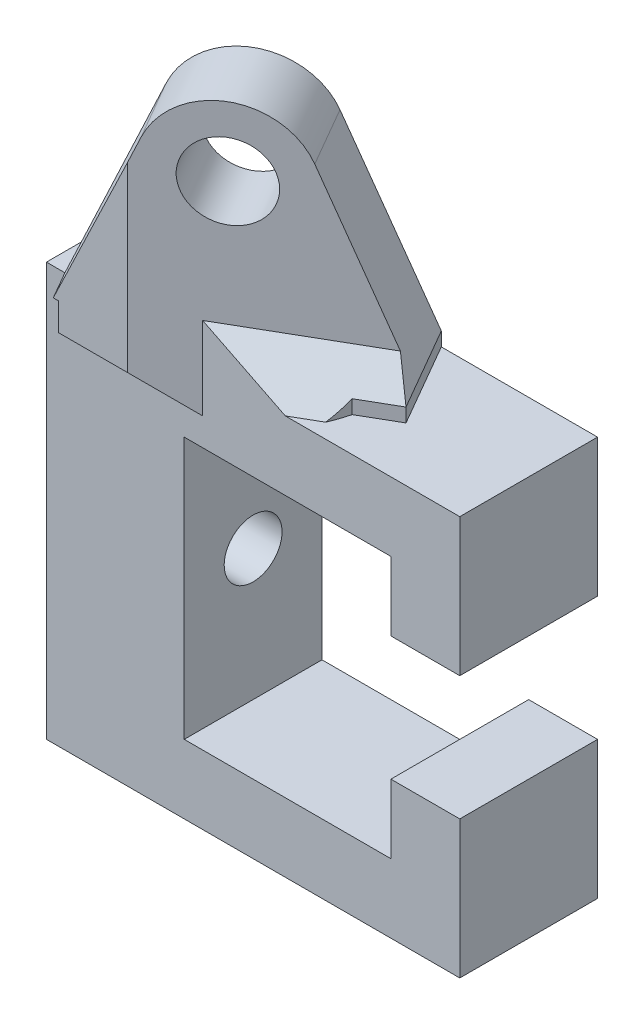
ISO-10303-21;
HEADER;
FILE_DESCRIPTION(('STEP AP214'),'2;1');
FILE_NAME('part.step','',(''),(''),'','','');
FILE_SCHEMA(('AUTOMOTIVE_DESIGN { 1 0 10303 214 1 1 1 1 }'));
ENDSEC;
DATA;
#1=APPLICATION_CONTEXT('core data for automotive mechanical design processes');
#2=APPLICATION_PROTOCOL_DEFINITION('international standard','automotive_design',2000,#1);
#3=PRODUCT_CONTEXT('',#1,'mechanical');
#4=PRODUCT('Part','Part','',(#3));
#5=PRODUCT_RELATED_PRODUCT_CATEGORY('part','',(#4));
#6=PRODUCT_DEFINITION_FORMATION('','',#4);
#7=PRODUCT_DEFINITION_CONTEXT('part definition',#1,'design');
#8=PRODUCT_DEFINITION('design','',#6,#7);
#9=PRODUCT_DEFINITION_SHAPE('','',#8);
#10=(LENGTH_UNIT() NAMED_UNIT(*) SI_UNIT(.MILLI.,.METRE.));
#11=(NAMED_UNIT(*) PLANE_ANGLE_UNIT() SI_UNIT($,.RADIAN.));
#12=(NAMED_UNIT(*) SI_UNIT($,.STERADIAN.) SOLID_ANGLE_UNIT());
#13=UNCERTAINTY_MEASURE_WITH_UNIT(LENGTH_MEASURE(1.E-05),#10,'distance_accuracy_value','');
#14=(GEOMETRIC_REPRESENTATION_CONTEXT(3) GLOBAL_UNCERTAINTY_ASSIGNED_CONTEXT((#13)) GLOBAL_UNIT_ASSIGNED_CONTEXT((#10,
#11,#12)) REPRESENTATION_CONTEXT('',''));
#15=CARTESIAN_POINT('',(0.,0.,0.));
#16=DIRECTION('',(0.,0.,1.));
#17=DIRECTION('',(1.,0.,0.));
#18=AXIS2_PLACEMENT_3D('',#15,#16,#17);
#19=CARTESIAN_POINT('',(0.,25.,0.));
#20=DIRECTION('',(0.,-1.,0.));
#21=DIRECTION('',(1.,0.,0.));
#22=AXIS2_PLACEMENT_3D('',#19,#20,#21);
#23=CYLINDRICAL_SURFACE('',#22,10.);
#24=DIRECTION('',(0.,1.,0.));
#25=VECTOR('',#24,1.);
#26=CARTESIAN_POINT('',(9.68465843842647,24.,2.49146361221968));
#27=LINE('',#26,#25);
#28=CARTESIAN_POINT('',(9.68465843842647,24.,2.49146361221968));
#29=VERTEX_POINT('',#28);
#30=CARTESIAN_POINT('',(9.68465843842647,25.,2.49146361221968));
#31=VERTEX_POINT('',#30);
#32=EDGE_CURVE('E203',#29,#31,#27,.T.);
#33=ORIENTED_EDGE('',*,*,#32,.T.);
#34=CARTESIAN_POINT('',(0.,32.0000000000001,0.));
#35=DIRECTION('',(-0.353553390593276,-0.707106781186544,-0.612372435695798));
#36=DIRECTION('',(0.353553390593273,-0.707106781186552,0.612372435695791));
#37=AXIS2_PLACEMENT_3D('',#34,#35,#36);
#38=ELLIPSE('',#37,14.142135623731,10.);
#39=CARTESIAN_POINT('',(9.19615242270661,24.,3.92820323027554));
#40=VERTEX_POINT('',#39);
#41=EDGE_CURVE('E190',#31,#40,#38,.T.);
#42=ORIENTED_EDGE('',*,*,#41,.T.);
#43=CARTESIAN_POINT('',(0.,24.,0.));
#44=DIRECTION('',(0.,1.,0.));
#45=DIRECTION('',(-1.,0.,0.));
#46=AXIS2_PLACEMENT_3D('',#43,#44,#45);
#47=CIRCLE('',#46,10.);
#48=EDGE_CURVE('E204',#40,#29,#47,.T.);
#49=ORIENTED_EDGE('',*,*,#48,.T.);
#50=EDGE_LOOP('',(#33,#42,#49));
#51=FACE_BOUND('',#50,.T.);
#52=ADVANCED_FACE('F35',(#51),#23,.T.);
#53=CARTESIAN_POINT('',(20.,24.,5.));
#54=DIRECTION('',(0.,-1.,0.));
#55=DIRECTION('',(1.,0.,0.));
#56=AXIS2_PLACEMENT_3D('',#53,#54,#55);
#57=PLANE('',#56);
#58=DIRECTION('',(0.500000000000001,0.,0.866025403784438));
#59=VECTOR('',#58,1.);
#60=CARTESIAN_POINT('',(8.66025403784438,24.,-5.00000000000001));
#61=LINE('',#60,#59);
#62=CARTESIAN_POINT('',(8.66025403784438,24.,-5.00000000000001));
#63=VERTEX_POINT('',#62);
#64=CARTESIAN_POINT('',(12.1602540378444,24.,1.06217782649109));
#65=VERTEX_POINT('',#64);
#66=EDGE_CURVE('E50',#63,#65,#61,.T.);
#67=ORIENTED_EDGE('',*,*,#66,.T.);
#68=DIRECTION('',(-0.866025403784438,0.,0.5));
#69=VECTOR('',#68,1.);
#70=CARTESIAN_POINT('',(12.1602540378444,24.,1.06217782649109));
#71=LINE('',#70,#69);
#72=EDGE_CURVE('E55',#65,#29,#71,.T.);
#73=ORIENTED_EDGE('',*,*,#72,.T.);
#74=ORIENTED_EDGE('',*,*,#48,.F.);
#75=DIRECTION('',(-0.866025403784438,0.,0.500000000000001));
#76=VECTOR('',#75,1.);
#77=CARTESIAN_POINT('',(16.8349364905389,24.,-0.482050807568867));
#78=LINE('',#77,#76);
#79=CARTESIAN_POINT('',(7.33974596215565,24.,5.));
#80=VERTEX_POINT('',#79);
#81=EDGE_CURVE('E198',#40,#80,#78,.T.);
#82=ORIENTED_EDGE('',*,*,#81,.T.);
#83=DIRECTION('',(-1.,0.,0.));
#84=VECTOR('',#83,1.);
#85=CARTESIAN_POINT('',(20.,24.,5.));
#86=LINE('',#85,#84);
#87=CARTESIAN_POINT('',(20.,24.,5.));
#88=VERTEX_POINT('',#87);
#89=EDGE_CURVE('E312',#88,#80,#86,.T.);
#90=ORIENTED_EDGE('',*,*,#89,.F.);
#91=DIRECTION('',(0.,0.,-1.));
#92=VECTOR('',#91,1.);
#93=CARTESIAN_POINT('',(20.,24.,5.));
#94=LINE('',#93,#92);
#95=CARTESIAN_POINT('',(20.,24.,-5.));
#96=VERTEX_POINT('',#95);
#97=EDGE_CURVE('E353',#88,#96,#94,.T.);
#98=ORIENTED_EDGE('',*,*,#97,.T.);
#99=DIRECTION('',(-1.,0.,0.));
#100=VECTOR('',#99,1.);
#101=CARTESIAN_POINT('',(20.,24.,-5.));
#102=LINE('',#101,#100);
#103=EDGE_CURVE('E338',#96,#63,#102,.T.);
#104=ORIENTED_EDGE('',*,*,#103,.T.);
#105=EDGE_LOOP('',(#67,#73,#74,#82,#90,#98,#104));
#106=FACE_BOUND('',#105,.T.);
#107=ADVANCED_FACE('F383',(#106),#57,.F.);
#108=CARTESIAN_POINT('',(0.,36.,0.));
#109=DIRECTION('',(0.500000000000001,0.,0.866025403784438));
#110=DIRECTION('',(0.866025403784438,0.,-0.500000000000001));
#111=AXIS2_PLACEMENT_3D('',#108,#109,#110);
#112=PLANE('',#111);
#113=CARTESIAN_POINT('',(0.,36.,0.));
#114=DIRECTION('',(0.500000000000001,0.,0.866025403784438));
#115=DIRECTION('',(0.866025403784438,0.,-0.500000000000001));
#116=AXIS2_PLACEMENT_3D('',#113,#114,#115);
#117=CIRCLE('',#116,2.75);
#118=CARTESIAN_POINT('',(2.38156986040721,36.,-1.375));
#119=VERTEX_POINT('',#118);
#120=EDGE_CURVE('E250',#119,#119,#117,.T.);
#121=ORIENTED_EDGE('',*,*,#120,.T.);
#122=EDGE_LOOP('',(#121));
#123=FACE_BOUND('',#122,.T.);
#124=DIRECTION('',(0.866025403784438,0.,-0.500000000000001));
#125=VECTOR('',#124,1.);
#126=CARTESIAN_POINT('',(-8.66025403784439,25.,5.00000000000001));
#127=LINE('',#126,#125);
#128=CARTESIAN_POINT('',(-8.66025403784439,25.,5.00000000000001));
#129=VERTEX_POINT('',#128);
#130=CARTESIAN_POINT('',(8.66025403784438,25.,-5.00000000000001));
#131=VERTEX_POINT('',#130);
#132=EDGE_CURVE('E404',#129,#131,#127,.T.);
#133=ORIENTED_EDGE('',*,*,#132,.F.);
#134=DIRECTION('',(-0.333086693763246,-0.923076923076923,0.192307692307693));
#135=VECTOR('',#134,1.);
#136=CARTESIAN_POINT('',(-8.66025403784439,25.,5.00000000000001));
#137=LINE('',#136,#135);
#138=CARTESIAN_POINT('',(-3.99704032515894,37.9230769230769,2.30769230769231));
#139=VERTEX_POINT('',#138);
#140=EDGE_CURVE('E260',#139,#129,#137,.T.);
#141=ORIENTED_EDGE('',*,*,#140,.F.);
#142=CARTESIAN_POINT('',(0.,36.,0.));
#143=DIRECTION('',(0.500000000000001,0.,0.866025403784438));
#144=DIRECTION('',(0.866025403784438,0.,-0.500000000000001));
#145=AXIS2_PLACEMENT_3D('',#142,#143,#144);
#146=CIRCLE('',#145,5.);
#147=CARTESIAN_POINT('',(3.99704032515894,37.9230769230769,-2.30769230769231));
#148=VERTEX_POINT('',#147);
#149=EDGE_CURVE('E266',#148,#139,#146,.T.);
#150=ORIENTED_EDGE('',*,*,#149,.F.);
#151=DIRECTION('',(-0.333086693763245,0.923076923076923,0.192307692307693));
#152=VECTOR('',#151,1.);
#153=CARTESIAN_POINT('',(8.66025403784438,25.,-5.00000000000001));
#154=LINE('',#153,#152);
#155=EDGE_CURVE('E254',#131,#148,#154,.T.);
#156=ORIENTED_EDGE('',*,*,#155,.F.);
#157=EDGE_LOOP('',(#133,#141,#150,#156));
#158=FACE_BOUND('',#157,.T.);
#159=ADVANCED_FACE('F426',(#123,#158),#112,.F.);
#160=CARTESIAN_POINT('',(0.,25.,0.));
#161=DIRECTION('',(0.,1.,0.));
#162=DIRECTION('',(-1.,0.,0.));
#163=AXIS2_PLACEMENT_3D('',#160,#161,#162);
#164=CIRCLE('',#163,10.);
#165=CARTESIAN_POINT('',(-7.14142842854286,25.,7.));
#166=VERTEX_POINT('',#165);
#167=EDGE_CURVE('E281',#129,#166,#164,.T.);
#168=ORIENTED_EDGE('',*,*,#167,.F.);
#169=DIRECTION('',(0.,1.,0.));
#170=VECTOR('',#169,1.);
#171=CARTESIAN_POINT('',(-8.66025403784439,24.,5.00000000000001));
#172=LINE('',#171,#170);
#173=CARTESIAN_POINT('',(-8.66025403784439,21.,5.));
#174=VERTEX_POINT('',#173);
#175=EDGE_CURVE('E245',#174,#129,#172,.T.);
#176=ORIENTED_EDGE('',*,*,#175,.F.);
#177=CARTESIAN_POINT('',(0.,16.,0.));
#178=DIRECTION('',(0.,0.707106781186551,-0.707106781186544));
#179=DIRECTION('',(0.,-0.707106781186544,-0.707106781186551));
#180=AXIS2_PLACEMENT_3D('',#177,#178,#179);
#181=ELLIPSE('',#180,14.1421356237309,10.);
#182=CARTESIAN_POINT('',(-7.14142842854286,23.,7.));
#183=VERTEX_POINT('',#182);
#184=EDGE_CURVE('E218',#174,#183,#181,.T.);
#185=ORIENTED_EDGE('',*,*,#184,.T.);
#186=DIRECTION('',(0.,-1.,0.));
#187=VECTOR('',#186,1.);
#188=CARTESIAN_POINT('',(-7.14142842854286,25.,7.));
#189=LINE('',#188,#187);
#190=EDGE_CURVE('E228',#166,#183,#189,.T.);
#191=ORIENTED_EDGE('',*,*,#190,.F.);
#192=EDGE_LOOP('',(#168,#176,#185,#191));
#193=FACE_BOUND('',#192,.T.);
#194=ADVANCED_FACE('F417',(#193),#23,.T.);
#195=CARTESIAN_POINT('',(11.1602540378444,25.,-0.669872981077817));
#196=DIRECTION('',(0.,1.,0.));
#197=DIRECTION('',(0.,0.,1.));
#198=AXIS2_PLACEMENT_3D('',#195,#196,#197);
#199=PLANE('',#198);
#200=DIRECTION('',(1.,0.,0.));
#201=VECTOR('',#200,1.);
#202=CARTESIAN_POINT('',(11.1602540378444,25.,7.));
#203=LINE('',#202,#201);
#204=CARTESIAN_POINT('',(-7.50555349946514,25.,7.));
#205=VERTEX_POINT('',#204);
#206=EDGE_CURVE('E240',#205,#166,#203,.T.);
#207=ORIENTED_EDGE('',*,*,#206,.F.);
#208=DIRECTION('',(-0.500000000000001,0.,-0.866025403784438));
#209=VECTOR('',#208,1.);
#210=CARTESIAN_POINT('',(-6.16025403784438,25.,9.33012701892221));
#211=LINE('',#210,#209);
#212=EDGE_CURVE('E272',#205,#129,#211,.T.);
#213=ORIENTED_EDGE('',*,*,#212,.T.);
#214=ORIENTED_EDGE('',*,*,#167,.T.);
#215=EDGE_LOOP('',(#207,#213,#214));
#216=FACE_BOUND('',#215,.T.);
#217=ADVANCED_FACE('F427',(#216),#199,.F.);
#218=CARTESIAN_POINT('',(2.50000000000001,36.,4.33012701892219));
#219=DIRECTION('',(0.500000000000001,0.,0.866025403784438));
#220=DIRECTION('',(0.866025403784438,0.,-0.500000000000001));
#221=AXIS2_PLACEMENT_3D('',#218,#219,#220);
#222=PLANE('',#221);
#223=CARTESIAN_POINT('',(2.50000000000001,36.,4.33012701892219));
#224=DIRECTION('',(0.500000000000001,0.,0.866025403784438));
#225=DIRECTION('',(0.866025403784438,0.,-0.500000000000001));
#226=AXIS2_PLACEMENT_3D('',#223,#224,#225);
#227=CIRCLE('',#226,2.75);
#228=CARTESIAN_POINT('',(4.88156986040721,36.,2.95512701892219));
#229=VERTEX_POINT('',#228);
#230=EDGE_CURVE('E251',#229,#229,#227,.T.);
#231=ORIENTED_EDGE('',*,*,#230,.F.);
#232=EDGE_LOOP('',(#231));
#233=FACE_BOUND('',#232,.T.);
#234=DIRECTION('',(0.,-1.,0.));
#235=VECTOR('',#234,1.);
#236=CARTESIAN_POINT('',(-2.12435565298213,36.,7.));
#237=LINE('',#236,#235);
#238=CARTESIAN_POINT('',(-2.12435565298213,36.1846096908265,7.));
#239=VERTEX_POINT('',#238);
#240=CARTESIAN_POINT('',(-2.12435565298213,23.,7.));
#241=VERTEX_POINT('',#240);
#242=EDGE_CURVE('E225',#239,#241,#237,.T.);
#243=ORIENTED_EDGE('',*,*,#242,.T.);
#244=DIRECTION('',(0.774596669241484,-0.447213595499955,-0.44721359549996));
#245=VECTOR('',#244,1.);
#246=CARTESIAN_POINT('',(0.535898384862244,21.4641016151377,5.46410161513776));
#247=LINE('',#246,#245);
#248=CARTESIAN_POINT('',(1.33974596215562,21.,5.));
#249=VERTEX_POINT('',#248);
#250=EDGE_CURVE('E11',#241,#249,#247,.T.);
#251=ORIENTED_EDGE('',*,*,#250,.T.);
#252=DIRECTION('',(0.,1.,0.));
#253=VECTOR('',#252,1.);
#254=CARTESIAN_POINT('',(1.33974596215562,0.,5.));
#255=LINE('',#254,#253);
#256=CARTESIAN_POINT('',(1.33974596215562,27.0000000000001,5.));
#257=VERTEX_POINT('',#256);
#258=EDGE_CURVE('E235',#249,#257,#255,.T.);
#259=ORIENTED_EDGE('',*,*,#258,.T.);
#260=DIRECTION('',(0.866025403784438,0.,-0.500000000000001));
#261=VECTOR('',#260,1.);
#262=CARTESIAN_POINT('',(2.50000000000001,27.0000000000001,4.33012701892219));
#263=LINE('',#262,#261);
#264=CARTESIAN_POINT('',(10.4385662013573,27.0000000000001,-0.253206314411138));
#265=VERTEX_POINT('',#264);
#266=EDGE_CURVE('E378',#257,#265,#263,.T.);
#267=ORIENTED_EDGE('',*,*,#266,.T.);
#268=DIRECTION('',(-0.333086693763245,0.923076923076923,0.192307692307693));
#269=VECTOR('',#268,1.);
#270=CARTESIAN_POINT('',(11.1602540378444,25.,-0.669872981077817));
#271=LINE('',#270,#269);
#272=CARTESIAN_POINT('',(6.49704032515895,37.9230769230769,2.02243471122988));
#273=VERTEX_POINT('',#272);
#274=EDGE_CURVE('E257',#265,#273,#271,.T.);
#275=ORIENTED_EDGE('',*,*,#274,.T.);
#276=CARTESIAN_POINT('',(2.50000000000001,36.,4.33012701892219));
#277=DIRECTION('',(0.500000000000001,0.,0.866025403784438));
#278=DIRECTION('',(0.866025403784438,0.,-0.500000000000001));
#279=AXIS2_PLACEMENT_3D('',#276,#277,#278);
#280=CIRCLE('',#279,5.);
#281=CARTESIAN_POINT('',(-1.49704032515894,37.9230769230769,6.6378193266145));
#282=VERTEX_POINT('',#281);
#283=EDGE_CURVE('E259',#273,#282,#280,.T.);
#284=ORIENTED_EDGE('',*,*,#283,.T.);
#285=DIRECTION('',(-0.333086693763246,-0.923076923076923,0.192307692307693));
#286=VECTOR('',#285,1.);
#287=CARTESIAN_POINT('',(-6.16025403784438,25.,9.33012701892221));
#288=LINE('',#287,#286);
#289=EDGE_CURVE('E239',#282,#239,#288,.T.);
#290=ORIENTED_EDGE('',*,*,#289,.T.);
#291=EDGE_LOOP('',(#243,#251,#259,#267,#275,#284,#290));
#292=FACE_BOUND('',#291,.T.);
#293=ADVANCED_FACE('F234',(#233,#292),#222,.T.);
#294=CARTESIAN_POINT('',(-6.16025403784438,25.,9.33012701892221));
#295=DIRECTION('',(0.799408065031789,-0.384615384615385,-0.461538461538462));
#296=DIRECTION('',(-0.500000000000001,0.,-0.866025403784438));
#297=AXIS2_PLACEMENT_3D('',#294,#295,#296);
#298=PLANE('',#297);
#299=DIRECTION('',(-0.433554984762061,-0.901127113779166,0.));
#300=VECTOR('',#299,1.);
#301=CARTESIAN_POINT('',(-7.25267766081462,25.5255925606591,7.));
#302=LINE('',#301,#300);
#303=EDGE_CURVE('E286',#239,#205,#302,.T.);
#304=ORIENTED_EDGE('',*,*,#303,.F.);
#305=ORIENTED_EDGE('',*,*,#289,.F.);
#306=DIRECTION('',(-0.500000000000001,0.,-0.866025403784438));
#307=VECTOR('',#306,1.);
#308=CARTESIAN_POINT('',(-1.49704032515894,37.9230769230769,6.6378193266145));
#309=LINE('',#308,#307);
#310=EDGE_CURVE('E275',#282,#139,#309,.T.);
#311=ORIENTED_EDGE('',*,*,#310,.T.);
#312=ORIENTED_EDGE('',*,*,#140,.T.);
#313=ORIENTED_EDGE('',*,*,#212,.F.);
#314=EDGE_LOOP('',(#304,#305,#311,#312,#313));
#315=FACE_BOUND('',#314,.T.);
#316=ADVANCED_FACE('F423',(#315),#298,.F.);
#317=CARTESIAN_POINT('',(20.,5.,5.));
#318=DIRECTION('',(0.,-1.,0.));
#319=DIRECTION('',(0.,0.,-1.));
#320=AXIS2_PLACEMENT_3D('',#317,#318,#319);
#321=PLANE('',#320);
#322=DIRECTION('',(-1.,0.,0.));
#323=VECTOR('',#322,1.);
#324=CARTESIAN_POINT('',(20.,5.,-5.));
#325=LINE('',#324,#323);
#326=CARTESIAN_POINT('',(20.,5.,-5.));
#327=VERTEX_POINT('',#326);
#328=CARTESIAN_POINT('',(15.,5.,-5.));
#329=VERTEX_POINT('',#328);
#330=EDGE_CURVE('E291',#327,#329,#325,.T.);
#331=ORIENTED_EDGE('',*,*,#330,.T.);
#332=DIRECTION('',(0.,0.,-1.));
#333=VECTOR('',#332,1.);
#334=CARTESIAN_POINT('',(15.,5.,5.));
#335=LINE('',#334,#333);
#336=CARTESIAN_POINT('',(15.,5.,5.));
#337=VERTEX_POINT('',#336);
#338=EDGE_CURVE('E287',#337,#329,#335,.T.);
#339=ORIENTED_EDGE('',*,*,#338,.F.);
#340=DIRECTION('',(-1.,0.,0.));
#341=VECTOR('',#340,1.);
#342=CARTESIAN_POINT('',(20.,5.,5.));
#343=LINE('',#342,#341);
#344=CARTESIAN_POINT('',(20.,5.,5.));
#345=VERTEX_POINT('',#344);
#346=EDGE_CURVE('E294',#345,#337,#343,.T.);
#347=ORIENTED_EDGE('',*,*,#346,.F.);
#348=DIRECTION('',(0.,0.,-1.));
#349=VECTOR('',#348,1.);
#350=CARTESIAN_POINT('',(20.,5.,5.));
#351=LINE('',#350,#349);
#352=EDGE_CURVE('E321',#345,#327,#351,.T.);
#353=ORIENTED_EDGE('',*,*,#352,.T.);
#354=EDGE_LOOP('',(#331,#339,#347,#353));
#355=FACE_BOUND('',#354,.T.);
#356=ADVANCED_FACE('F494',(#355),#321,.F.);
#357=CARTESIAN_POINT('',(15.,5.,5.));
#358=DIRECTION('',(1.,0.,0.));
#359=DIRECTION('',(0.,1.,0.));
#360=AXIS2_PLACEMENT_3D('',#357,#358,#359);
#361=PLANE('',#360);
#362=DIRECTION('',(0.,-1.,0.));
#363=VECTOR('',#362,1.);
#364=CARTESIAN_POINT('',(15.,5.,-5.));
#365=LINE('',#364,#363);
#366=CARTESIAN_POINT('',(15.,0.,-5.));
#367=VERTEX_POINT('',#366);
#368=EDGE_CURVE('E324',#329,#367,#365,.T.);
#369=ORIENTED_EDGE('',*,*,#368,.T.);
#370=DIRECTION('',(0.,0.,-1.));
#371=VECTOR('',#370,1.);
#372=CARTESIAN_POINT('',(15.,0.,5.));
#373=LINE('',#372,#371);
#374=CARTESIAN_POINT('',(15.,0.,5.));
#375=VERTEX_POINT('',#374);
#376=EDGE_CURVE('E371',#375,#367,#373,.T.);
#377=ORIENTED_EDGE('',*,*,#376,.F.);
#378=DIRECTION('',(0.,-1.,0.));
#379=VECTOR('',#378,1.);
#380=CARTESIAN_POINT('',(15.,5.,5.));
#381=LINE('',#380,#379);
#382=EDGE_CURVE('E297',#337,#375,#381,.T.);
#383=ORIENTED_EDGE('',*,*,#382,.F.);
#384=ORIENTED_EDGE('',*,*,#338,.T.);
#385=EDGE_LOOP('',(#369,#377,#383,#384));
#386=FACE_BOUND('',#385,.T.);
#387=ADVANCED_FACE('F490',(#386),#361,.F.);
#388=CARTESIAN_POINT('',(15.,0.,5.));
#389=DIRECTION('',(0.,-1.,0.));
#390=DIRECTION('',(0.,0.,-1.));
#391=AXIS2_PLACEMENT_3D('',#388,#389,#390);
#392=PLANE('',#391);
#393=DIRECTION('',(-1.,0.,0.));
#394=VECTOR('',#393,1.);
#395=CARTESIAN_POINT('',(15.,0.,-5.));
#396=LINE('',#395,#394);
#397=CARTESIAN_POINT('',(0.,0.,-5.));
#398=VERTEX_POINT('',#397);
#399=EDGE_CURVE('E326',#367,#398,#396,.T.);
#400=ORIENTED_EDGE('',*,*,#399,.T.);
#401=DIRECTION('',(0.,0.,-1.));
#402=VECTOR('',#401,1.);
#403=CARTESIAN_POINT('',(0.,0.,5.));
#404=LINE('',#403,#402);
#405=CARTESIAN_POINT('',(0.,0.,5.));
#406=VERTEX_POINT('',#405);
#407=EDGE_CURVE('E368',#406,#398,#404,.T.);
#408=ORIENTED_EDGE('',*,*,#407,.F.);
#409=DIRECTION('',(-1.,0.,0.));
#410=VECTOR('',#409,1.);
#411=CARTESIAN_POINT('',(15.,0.,5.));
#412=LINE('',#411,#410);
#413=EDGE_CURVE('E300',#375,#406,#412,.T.);
#414=ORIENTED_EDGE('',*,*,#413,.F.);
#415=ORIENTED_EDGE('',*,*,#376,.T.);
#416=EDGE_LOOP('',(#400,#408,#414,#415));
#417=FACE_BOUND('',#416,.T.);
#418=ADVANCED_FACE('F486',(#417),#392,.F.);
#419=CARTESIAN_POINT('',(0.,0.,5.));
#420=DIRECTION('',(-1.,0.,0.));
#421=DIRECTION('',(0.,-1.,0.));
#422=AXIS2_PLACEMENT_3D('',#419,#420,#421);
#423=PLANE('',#422);
#424=CARTESIAN_POINT('',(0.,9.49999999999999,0.));
#425=DIRECTION('',(-1.,0.,0.));
#426=DIRECTION('',(0.,-1.,0.));
#427=AXIS2_PLACEMENT_3D('',#424,#425,#426);
#428=CIRCLE('',#427,2.1);
#429=CARTESIAN_POINT('',(0.,7.39999999999999,0.));
#430=VERTEX_POINT('',#429);
#431=EDGE_CURVE('E288',#430,#430,#428,.T.);
#432=ORIENTED_EDGE('',*,*,#431,.T.);
#433=EDGE_LOOP('',(#432));
#434=FACE_BOUND('',#433,.T.);
#435=DIRECTION('',(0.,1.,0.));
#436=VECTOR('',#435,1.);
#437=CARTESIAN_POINT('',(0.,0.,-5.));
#438=LINE('',#437,#436);
#439=CARTESIAN_POINT('',(0.,19.,-5.));
#440=VERTEX_POINT('',#439);
#441=EDGE_CURVE('E328',#398,#440,#438,.T.);
#442=ORIENTED_EDGE('',*,*,#441,.T.);
#443=DIRECTION('',(0.,0.,-1.));
#444=VECTOR('',#443,1.);
#445=CARTESIAN_POINT('',(0.,19.,5.));
#446=LINE('',#445,#444);
#447=CARTESIAN_POINT('',(0.,19.,5.));
#448=VERTEX_POINT('',#447);
#449=EDGE_CURVE('E365',#448,#440,#446,.T.);
#450=ORIENTED_EDGE('',*,*,#449,.F.);
#451=DIRECTION('',(0.,1.,0.));
#452=VECTOR('',#451,1.);
#453=CARTESIAN_POINT('',(0.,0.,5.));
#454=LINE('',#453,#452);
#455=EDGE_CURVE('E302',#406,#448,#454,.T.);
#456=ORIENTED_EDGE('',*,*,#455,.F.);
#457=ORIENTED_EDGE('',*,*,#407,.T.);
#458=EDGE_LOOP('',(#442,#450,#456,#457));
#459=FACE_BOUND('',#458,.T.);
#460=ADVANCED_FACE('F482',(#434,#459),#423,.F.);
#461=CARTESIAN_POINT('',(0.,19.,5.));
#462=DIRECTION('',(0.,1.,0.));
#463=DIRECTION('',(-1.,0.,0.));
#464=AXIS2_PLACEMENT_3D('',#461,#462,#463);
#465=PLANE('',#464);
#466=DIRECTION('',(1.,0.,0.));
#467=VECTOR('',#466,1.);
#468=CARTESIAN_POINT('',(0.,19.,-5.));
#469=LINE('',#468,#467);
#470=CARTESIAN_POINT('',(15.,19.,-5.));
#471=VERTEX_POINT('',#470);
#472=EDGE_CURVE('E330',#440,#471,#469,.T.);
#473=ORIENTED_EDGE('',*,*,#472,.T.);
#474=DIRECTION('',(0.,0.,-1.));
#475=VECTOR('',#474,1.);
#476=CARTESIAN_POINT('',(15.,19.,5.));
#477=LINE('',#476,#475);
#478=CARTESIAN_POINT('',(15.,19.,5.));
#479=VERTEX_POINT('',#478);
#480=EDGE_CURVE('E362',#479,#471,#477,.T.);
#481=ORIENTED_EDGE('',*,*,#480,.F.);
#482=DIRECTION('',(1.,0.,0.));
#483=VECTOR('',#482,1.);
#484=CARTESIAN_POINT('',(0.,19.,5.));
#485=LINE('',#484,#483);
#486=EDGE_CURVE('E304',#448,#479,#485,.T.);
#487=ORIENTED_EDGE('',*,*,#486,.F.);
#488=ORIENTED_EDGE('',*,*,#449,.T.);
#489=EDGE_LOOP('',(#473,#481,#487,#488));
#490=FACE_BOUND('',#489,.T.);
#491=ADVANCED_FACE('F478',(#490),#465,.F.);
#492=CARTESIAN_POINT('',(15.,19.,5.));
#493=DIRECTION('',(1.,0.,0.));
#494=DIRECTION('',(0.,1.,0.));
#495=AXIS2_PLACEMENT_3D('',#492,#493,#494);
#496=PLANE('',#495);
#497=DIRECTION('',(0.,-1.,0.));
#498=VECTOR('',#497,1.);
#499=CARTESIAN_POINT('',(15.,19.,-5.));
#500=LINE('',#499,#498);
#501=CARTESIAN_POINT('',(15.,14.,-5.));
#502=VERTEX_POINT('',#501);
#503=EDGE_CURVE('E332',#471,#502,#500,.T.);
#504=ORIENTED_EDGE('',*,*,#503,.T.);
#505=DIRECTION('',(0.,0.,-1.));
#506=VECTOR('',#505,1.);
#507=CARTESIAN_POINT('',(15.,14.,5.));
#508=LINE('',#507,#506);
#509=CARTESIAN_POINT('',(15.,14.,5.));
#510=VERTEX_POINT('',#509);
#511=EDGE_CURVE('E359',#510,#502,#508,.T.);
#512=ORIENTED_EDGE('',*,*,#511,.F.);
#513=DIRECTION('',(0.,-1.,0.));
#514=VECTOR('',#513,1.);
#515=CARTESIAN_POINT('',(15.,19.,5.));
#516=LINE('',#515,#514);
#517=EDGE_CURVE('E306',#479,#510,#516,.T.);
#518=ORIENTED_EDGE('',*,*,#517,.F.);
#519=ORIENTED_EDGE('',*,*,#480,.T.);
#520=EDGE_LOOP('',(#504,#512,#518,#519));
#521=FACE_BOUND('',#520,.T.);
#522=ADVANCED_FACE('F474',(#521),#496,.F.);
#523=CARTESIAN_POINT('',(15.,14.,5.));
#524=DIRECTION('',(0.,1.,0.));
#525=DIRECTION('',(0.,0.,1.));
#526=AXIS2_PLACEMENT_3D('',#523,#524,#525);
#527=PLANE('',#526);
#528=DIRECTION('',(1.,0.,0.));
#529=VECTOR('',#528,1.);
#530=CARTESIAN_POINT('',(15.,14.,-5.));
#531=LINE('',#530,#529);
#532=CARTESIAN_POINT('',(20.,14.,-5.));
#533=VERTEX_POINT('',#532);
#534=EDGE_CURVE('E334',#502,#533,#531,.T.);
#535=ORIENTED_EDGE('',*,*,#534,.T.);
#536=DIRECTION('',(0.,0.,-1.));
#537=VECTOR('',#536,1.);
#538=CARTESIAN_POINT('',(20.,14.,5.));
#539=LINE('',#538,#537);
#540=CARTESIAN_POINT('',(20.,14.,5.));
#541=VERTEX_POINT('',#540);
#542=EDGE_CURVE('E356',#541,#533,#539,.T.);
#543=ORIENTED_EDGE('',*,*,#542,.F.);
#544=DIRECTION('',(1.,0.,0.));
#545=VECTOR('',#544,1.);
#546=CARTESIAN_POINT('',(15.,14.,5.));
#547=LINE('',#546,#545);
#548=EDGE_CURVE('E308',#510,#541,#547,.T.);
#549=ORIENTED_EDGE('',*,*,#548,.F.);
#550=ORIENTED_EDGE('',*,*,#511,.T.);
#551=EDGE_LOOP('',(#535,#543,#549,#550));
#552=FACE_BOUND('',#551,.T.);
#553=ADVANCED_FACE('F471',(#552),#527,.F.);
#554=CARTESIAN_POINT('',(20.,14.,5.));
#555=DIRECTION('',(-1.,0.,0.));
#556=DIRECTION('',(0.,0.,1.));
#557=AXIS2_PLACEMENT_3D('',#554,#555,#556);
#558=PLANE('',#557);
#559=DIRECTION('',(0.,1.,0.));
#560=VECTOR('',#559,1.);
#561=CARTESIAN_POINT('',(20.,14.,-5.));
#562=LINE('',#561,#560);
#563=EDGE_CURVE('E336',#533,#96,#562,.T.);
#564=ORIENTED_EDGE('',*,*,#563,.T.);
#565=ORIENTED_EDGE('',*,*,#97,.F.);
#566=DIRECTION('',(0.,1.,0.));
#567=VECTOR('',#566,1.);
#568=CARTESIAN_POINT('',(20.,14.,5.));
#569=LINE('',#568,#567);
#570=EDGE_CURVE('E310',#541,#88,#569,.T.);
#571=ORIENTED_EDGE('',*,*,#570,.F.);
#572=ORIENTED_EDGE('',*,*,#542,.T.);
#573=EDGE_LOOP('',(#564,#565,#571,#572));
#574=FACE_BOUND('',#573,.T.);
#575=ADVANCED_FACE('F466',(#574),#558,.F.);
#576=CARTESIAN_POINT('',(-10.,24.,5.));
#577=DIRECTION('',(1.,0.,0.));
#578=DIRECTION('',(0.,1.,0.));
#579=AXIS2_PLACEMENT_3D('',#576,#577,#578);
#580=PLANE('',#579);
#581=CARTESIAN_POINT('',(-10.,9.49999999999999,0.));
#582=DIRECTION('',(-1.,0.,0.));
#583=DIRECTION('',(0.,-1.,0.));
#584=AXIS2_PLACEMENT_3D('',#581,#582,#583);
#585=CIRCLE('',#584,2.1);
#586=CARTESIAN_POINT('',(-10.,7.39999999999999,0.));
#587=VERTEX_POINT('',#586);
#588=EDGE_CURVE('E284',#587,#587,#585,.T.);
#589=ORIENTED_EDGE('',*,*,#588,.F.);
#590=EDGE_LOOP('',(#589));
#591=FACE_BOUND('',#590,.T.);
#592=DIRECTION('',(0.,-1.,0.));
#593=VECTOR('',#592,1.);
#594=CARTESIAN_POINT('',(-10.,24.,-5.));
#595=LINE('',#594,#593);
#596=CARTESIAN_POINT('',(-10.,25.,-5.));
#597=VERTEX_POINT('',#596);
#598=CARTESIAN_POINT('',(-10.,-5.,-5.));
#599=VERTEX_POINT('',#598);
#600=EDGE_CURVE('E340',#597,#599,#595,.T.);
#601=ORIENTED_EDGE('',*,*,#600,.T.);
#602=DIRECTION('',(0.,0.,-1.));
#603=VECTOR('',#602,1.);
#604=CARTESIAN_POINT('',(-10.,-5.,5.));
#605=LINE('',#604,#603);
#606=CARTESIAN_POINT('',(-10.,-5.,5.));
#607=VERTEX_POINT('',#606);
#608=EDGE_CURVE('E350',#607,#599,#605,.T.);
#609=ORIENTED_EDGE('',*,*,#608,.F.);
#610=DIRECTION('',(0.,-1.,0.));
#611=VECTOR('',#610,1.);
#612=CARTESIAN_POINT('',(-10.,24.,5.));
#613=LINE('',#612,#611);
#614=CARTESIAN_POINT('',(-10.,25.,5.));
#615=VERTEX_POINT('',#614);
#616=EDGE_CURVE('E315',#615,#607,#613,.T.);
#617=ORIENTED_EDGE('',*,*,#616,.F.);
#618=DIRECTION('',(0.,0.,1.));
#619=VECTOR('',#618,1.);
#620=CARTESIAN_POINT('',(-10.,25.,-5.));
#621=LINE('',#620,#619);
#622=EDGE_CURVE('E407',#597,#615,#621,.T.);
#623=ORIENTED_EDGE('',*,*,#622,.F.);
#624=EDGE_LOOP('',(#601,#609,#617,#623));
#625=FACE_BOUND('',#624,.T.);
#626=ADVANCED_FACE('F463',(#591,#625),#580,.F.);
#627=CARTESIAN_POINT('',(-10.,-5.,5.));
#628=DIRECTION('',(0.,1.,0.));
#629=DIRECTION('',(0.,0.,1.));
#630=AXIS2_PLACEMENT_3D('',#627,#628,#629);
#631=PLANE('',#630);
#632=DIRECTION('',(1.,0.,0.));
#633=VECTOR('',#632,1.);
#634=CARTESIAN_POINT('',(-10.,-5.,-5.));
#635=LINE('',#634,#633);
#636=CARTESIAN_POINT('',(20.,-5.,-5.));
#637=VERTEX_POINT('',#636);
#638=EDGE_CURVE('E342',#599,#637,#635,.T.);
#639=ORIENTED_EDGE('',*,*,#638,.T.);
#640=DIRECTION('',(0.,0.,-1.));
#641=VECTOR('',#640,1.);
#642=CARTESIAN_POINT('',(20.,-5.,5.));
#643=LINE('',#642,#641);
#644=CARTESIAN_POINT('',(20.,-5.,5.));
#645=VERTEX_POINT('',#644);
#646=EDGE_CURVE('E347',#645,#637,#643,.T.);
#647=ORIENTED_EDGE('',*,*,#646,.F.);
#648=DIRECTION('',(1.,0.,0.));
#649=VECTOR('',#648,1.);
#650=CARTESIAN_POINT('',(-10.,-5.,5.));
#651=LINE('',#650,#649);
#652=EDGE_CURVE('E317',#607,#645,#651,.T.);
#653=ORIENTED_EDGE('',*,*,#652,.F.);
#654=ORIENTED_EDGE('',*,*,#608,.T.);
#655=EDGE_LOOP('',(#639,#647,#653,#654));
#656=FACE_BOUND('',#655,.T.);
#657=ADVANCED_FACE('F459',(#656),#631,.F.);
#658=CARTESIAN_POINT('',(20.,-5.,5.));
#659=DIRECTION('',(-1.,0.,0.));
#660=DIRECTION('',(0.,0.,1.));
#661=AXIS2_PLACEMENT_3D('',#658,#659,#660);
#662=PLANE('',#661);
#663=DIRECTION('',(0.,1.,0.));
#664=VECTOR('',#663,1.);
#665=CARTESIAN_POINT('',(20.,-5.,-5.));
#666=LINE('',#665,#664);
#667=EDGE_CURVE('E298',#637,#327,#666,.T.);
#668=ORIENTED_EDGE('',*,*,#667,.T.);
#669=ORIENTED_EDGE('',*,*,#352,.F.);
#670=DIRECTION('',(0.,1.,0.));
#671=VECTOR('',#670,1.);
#672=CARTESIAN_POINT('',(20.,-5.,5.));
#673=LINE('',#672,#671);
#674=EDGE_CURVE('E319',#645,#345,#673,.T.);
#675=ORIENTED_EDGE('',*,*,#674,.F.);
#676=ORIENTED_EDGE('',*,*,#646,.T.);
#677=EDGE_LOOP('',(#668,#669,#675,#676));
#678=FACE_BOUND('',#677,.T.);
#679=ADVANCED_FACE('F454',(#678),#662,.F.);
#680=CARTESIAN_POINT('',(0.,0.,5.));
#681=DIRECTION('',(0.,0.,1.));
#682=DIRECTION('',(1.,0.,0.));
#683=AXIS2_PLACEMENT_3D('',#680,#681,#682);
#684=PLANE('',#683);
#685=DIRECTION('',(-1.,0.,0.));
#686=VECTOR('',#685,1.);
#687=CARTESIAN_POINT('',(0.,21.,5.));
#688=LINE('',#687,#686);
#689=EDGE_CURVE('E200',#249,#174,#688,.T.);
#690=ORIENTED_EDGE('',*,*,#689,.T.);
#691=ORIENTED_EDGE('',*,*,#175,.T.);
#692=DIRECTION('',(1.,0.,0.));
#693=VECTOR('',#692,1.);
#694=CARTESIAN_POINT('',(-10.,25.,5.));
#695=LINE('',#694,#693);
#696=EDGE_CURVE('E410',#615,#129,#695,.T.);
#697=ORIENTED_EDGE('',*,*,#696,.F.);
#698=ORIENTED_EDGE('',*,*,#616,.T.);
#699=ORIENTED_EDGE('',*,*,#652,.T.);
#700=ORIENTED_EDGE('',*,*,#674,.T.);
#701=ORIENTED_EDGE('',*,*,#346,.T.);
#702=ORIENTED_EDGE('',*,*,#382,.T.);
#703=ORIENTED_EDGE('',*,*,#413,.T.);
#704=ORIENTED_EDGE('',*,*,#455,.T.);
#705=ORIENTED_EDGE('',*,*,#486,.T.);
#706=ORIENTED_EDGE('',*,*,#517,.T.);
#707=ORIENTED_EDGE('',*,*,#548,.T.);
#708=ORIENTED_EDGE('',*,*,#570,.T.);
#709=ORIENTED_EDGE('',*,*,#89,.T.);
#710=DIRECTION('',(-0.894427190999914,0.447213595499963,0.));
#711=VECTOR('',#710,1.);
#712=CARTESIAN_POINT('',(14.9358983848622,20.2019237886467,5.));
#713=LINE('',#712,#711);
#714=EDGE_CURVE('E212',#80,#257,#713,.T.);
#715=ORIENTED_EDGE('',*,*,#714,.T.);
#716=ORIENTED_EDGE('',*,*,#258,.F.);
#717=EDGE_LOOP('',(#690,#691,#697,#698,#699,#700,#701,#702,#703,#704,#705,#706,#707,#708,#709,
#715,#716));
#718=FACE_BOUND('',#717,.T.);
#719=ADVANCED_FACE('F381',(#718),#684,.T.);
#720=CARTESIAN_POINT('',(0.,0.,-5.));
#721=DIRECTION('',(0.,0.,1.));
#722=DIRECTION('',(1.,0.,0.));
#723=AXIS2_PLACEMENT_3D('',#720,#721,#722);
#724=PLANE('',#723);
#725=ORIENTED_EDGE('',*,*,#330,.F.);
#726=ORIENTED_EDGE('',*,*,#667,.F.);
#727=ORIENTED_EDGE('',*,*,#638,.F.);
#728=ORIENTED_EDGE('',*,*,#600,.F.);
#729=DIRECTION('',(-1.,0.,0.));
#730=VECTOR('',#729,1.);
#731=CARTESIAN_POINT('',(8.66025403784438,25.,-5.00000000000001));
#732=LINE('',#731,#730);
#733=EDGE_CURVE('E396',#131,#597,#732,.T.);
#734=ORIENTED_EDGE('',*,*,#733,.F.);
#735=DIRECTION('',(0.,1.,0.));
#736=VECTOR('',#735,1.);
#737=CARTESIAN_POINT('',(8.66025403784438,24.,-5.00000000000001));
#738=LINE('',#737,#736);
#739=EDGE_CURVE('E241',#63,#131,#738,.T.);
#740=ORIENTED_EDGE('',*,*,#739,.F.);
#741=ORIENTED_EDGE('',*,*,#103,.F.);
#742=ORIENTED_EDGE('',*,*,#563,.F.);
#743=ORIENTED_EDGE('',*,*,#534,.F.);
#744=ORIENTED_EDGE('',*,*,#503,.F.);
#745=ORIENTED_EDGE('',*,*,#472,.F.);
#746=ORIENTED_EDGE('',*,*,#441,.F.);
#747=ORIENTED_EDGE('',*,*,#399,.F.);
#748=ORIENTED_EDGE('',*,*,#368,.F.);
#749=EDGE_LOOP('',(#725,#726,#727,#728,#734,#740,#741,#742,#743,#744,#745,#746,#747,#748));
#750=FACE_BOUND('',#749,.T.);
#751=ADVANCED_FACE('F392',(#750),#724,.F.);
#752=CARTESIAN_POINT('',(0.,9.49999999999999,0.));
#753=DIRECTION('',(-1.,0.,0.));
#754=DIRECTION('',(0.,-1.,0.));
#755=AXIS2_PLACEMENT_3D('',#752,#753,#754);
#756=CYLINDRICAL_SURFACE('',#755,2.1);
#757=ORIENTED_EDGE('',*,*,#431,.F.);
#758=EDGE_LOOP('',(#757));
#759=FACE_BOUND('',#758,.T.);
#760=ORIENTED_EDGE('',*,*,#588,.T.);
#761=EDGE_LOOP('',(#760));
#762=FACE_BOUND('',#761,.T.);
#763=ADVANCED_FACE('F448',(#759,#762),#756,.F.);
#764=CARTESIAN_POINT('',(11.1602540378444,25.,-0.669872981077817));
#765=DIRECTION('',(-0.799408065031789,-0.384615384615384,0.461538461538463));
#766=DIRECTION('',(0.500000000000001,0.,0.866025403784438));
#767=AXIS2_PLACEMENT_3D('',#764,#765,#766);
#768=PLANE('',#767);
#769=ORIENTED_EDGE('',*,*,#155,.T.);
#770=DIRECTION('',(-0.500000000000001,0.,-0.866025403784438));
#771=VECTOR('',#770,1.);
#772=CARTESIAN_POINT('',(6.49704032515895,37.9230769230769,2.02243471122988));
#773=LINE('',#772,#771);
#774=EDGE_CURVE('E278',#273,#148,#773,.T.);
#775=ORIENTED_EDGE('',*,*,#774,.F.);
#776=ORIENTED_EDGE('',*,*,#274,.F.);
#777=DIRECTION('',(0.583893301303346,-0.678280102733069,0.446099445112294));
#778=VECTOR('',#777,1.);
#779=CARTESIAN_POINT('',(11.368167621058,25.9201277955272,0.457017071571222));
#780=LINE('',#779,#778);
#781=CARTESIAN_POINT('',(12.1602540378444,25.,1.06217782649109));
#782=VERTEX_POINT('',#781);
#783=EDGE_CURVE('E210',#265,#782,#780,.T.);
#784=ORIENTED_EDGE('',*,*,#783,.T.);
#785=DIRECTION('',(-0.500000000000001,0.,-0.866025403784438));
#786=VECTOR('',#785,1.);
#787=CARTESIAN_POINT('',(11.1602540378444,25.,-0.669872981077817));
#788=LINE('',#787,#786);
#789=EDGE_CURVE('E263',#782,#131,#788,.T.);
#790=ORIENTED_EDGE('',*,*,#789,.T.);
#791=EDGE_LOOP('',(#769,#775,#776,#784,#790));
#792=FACE_BOUND('',#791,.T.);
#793=ADVANCED_FACE('F446',(#792),#768,.F.);
#794=CARTESIAN_POINT('',(2.50000000000001,36.,4.33012701892219));
#795=DIRECTION('',(-0.500000000000001,0.,-0.866025403784438));
#796=DIRECTION('',(-0.866025403784438,0.,0.500000000000001));
#797=AXIS2_PLACEMENT_3D('',#794,#795,#796);
#798=CYLINDRICAL_SURFACE('',#797,5.);
#799=ORIENTED_EDGE('',*,*,#149,.T.);
#800=ORIENTED_EDGE('',*,*,#310,.F.);
#801=ORIENTED_EDGE('',*,*,#283,.F.);
#802=ORIENTED_EDGE('',*,*,#774,.T.);
#803=EDGE_LOOP('',(#799,#800,#801,#802));
#804=FACE_BOUND('',#803,.T.);
#805=ADVANCED_FACE('F509',(#804),#798,.T.);
#806=CARTESIAN_POINT('',(2.50000000000001,36.,4.33012701892219));
#807=DIRECTION('',(-0.500000000000001,0.,-0.866025403784438));
#808=DIRECTION('',(-0.866025403784438,0.,0.500000000000001));
#809=AXIS2_PLACEMENT_3D('',#806,#807,#808);
#810=CYLINDRICAL_SURFACE('',#809,2.75);
#811=ORIENTED_EDGE('',*,*,#230,.T.);
#812=EDGE_LOOP('',(#811));
#813=FACE_BOUND('',#812,.T.);
#814=ORIENTED_EDGE('',*,*,#120,.F.);
#815=EDGE_LOOP('',(#814));
#816=FACE_BOUND('',#815,.T.);
#817=ADVANCED_FACE('F504',(#813,#816),#810,.F.);
#818=CARTESIAN_POINT('',(0.,41.,7.));
#819=DIRECTION('',(0.,0.,1.));
#820=DIRECTION('',(1.,0.,0.));
#821=AXIS2_PLACEMENT_3D('',#818,#819,#820);
#822=PLANE('',#821);
#823=ORIENTED_EDGE('',*,*,#190,.T.);
#824=DIRECTION('',(1.,0.,0.));
#825=VECTOR('',#824,1.);
#826=CARTESIAN_POINT('',(0.,23.,7.));
#827=LINE('',#826,#825);
#828=EDGE_CURVE('E43',#183,#241,#827,.T.);
#829=ORIENTED_EDGE('',*,*,#828,.T.);
#830=ORIENTED_EDGE('',*,*,#242,.F.);
#831=ORIENTED_EDGE('',*,*,#303,.T.);
#832=ORIENTED_EDGE('',*,*,#206,.T.);
#833=EDGE_LOOP('',(#823,#829,#830,#831,#832));
#834=FACE_BOUND('',#833,.T.);
#835=ADVANCED_FACE('F224',(#834),#822,.T.);
#836=CARTESIAN_POINT('',(16.8349364905389,24.,-0.482050807568868));
#837=DIRECTION('',(-0.353553390593276,-0.707106781186544,-0.612372435695798));
#838=DIRECTION('',(-0.866025403784438,0.,0.500000000000001));
#839=AXIS2_PLACEMENT_3D('',#836,#837,#838);
#840=PLANE('',#839);
#841=ORIENTED_EDGE('',*,*,#783,.F.);
#842=ORIENTED_EDGE('',*,*,#266,.F.);
#843=ORIENTED_EDGE('',*,*,#714,.F.);
#844=ORIENTED_EDGE('',*,*,#81,.F.);
#845=ORIENTED_EDGE('',*,*,#41,.F.);
#846=DIRECTION('',(-0.866025403784438,0.,0.500000000000001));
#847=VECTOR('',#846,1.);
#848=CARTESIAN_POINT('',(12.1602540378444,25.,1.06217782649109));
#849=LINE('',#848,#847);
#850=EDGE_CURVE('E195',#782,#31,#849,.T.);
#851=ORIENTED_EDGE('',*,*,#850,.F.);
#852=EDGE_LOOP('',(#841,#842,#843,#844,#845,#851));
#853=FACE_BOUND('',#852,.T.);
#854=ADVANCED_FACE('F193',(#853),#840,.F.);
#855=CARTESIAN_POINT('',(0.,21.,5.));
#856=DIRECTION('',(0.,0.707106781186551,-0.707106781186544));
#857=DIRECTION('',(-1.,0.,0.));
#858=AXIS2_PLACEMENT_3D('',#855,#856,#857);
#859=PLANE('',#858);
#860=ORIENTED_EDGE('',*,*,#250,.F.);
#861=ORIENTED_EDGE('',*,*,#828,.F.);
#862=ORIENTED_EDGE('',*,*,#184,.F.);
#863=ORIENTED_EDGE('',*,*,#689,.F.);
#864=EDGE_LOOP('',(#860,#861,#862,#863));
#865=FACE_BOUND('',#864,.T.);
#866=ADVANCED_FACE('F37',(#865),#859,.F.);
#867=CARTESIAN_POINT('',(0.,25.,0.));
#868=DIRECTION('',(0.,-1.,0.));
#869=DIRECTION('',(0.,0.,-1.));
#870=AXIS2_PLACEMENT_3D('',#867,#868,#869);
#871=PLANE('',#870);
#872=ORIENTED_EDGE('',*,*,#132,.T.);
#873=ORIENTED_EDGE('',*,*,#733,.T.);
#874=ORIENTED_EDGE('',*,*,#622,.T.);
#875=ORIENTED_EDGE('',*,*,#696,.T.);
#876=EDGE_LOOP('',(#872,#873,#874,#875));
#877=FACE_BOUND('',#876,.T.);
#878=ADVANCED_FACE('F503',(#877),#871,.F.);
#879=CARTESIAN_POINT('',(8.66025403784438,24.,-5.00000000000001));
#880=DIRECTION('',(-0.866025403784438,0.,0.500000000000001));
#881=DIRECTION('',(0.500000000000001,0.,0.866025403784438));
#882=AXIS2_PLACEMENT_3D('',#879,#880,#881);
#883=PLANE('',#882);
#884=ORIENTED_EDGE('',*,*,#789,.F.);
#885=DIRECTION('',(0.,1.,0.));
#886=VECTOR('',#885,1.);
#887=CARTESIAN_POINT('',(12.1602540378444,24.,1.06217782649109));
#888=LINE('',#887,#886);
#889=EDGE_CURVE('E206',#65,#782,#888,.T.);
#890=ORIENTED_EDGE('',*,*,#889,.F.);
#891=ORIENTED_EDGE('',*,*,#66,.F.);
#892=ORIENTED_EDGE('',*,*,#739,.T.);
#893=EDGE_LOOP('',(#884,#890,#891,#892));
#894=FACE_BOUND('',#893,.T.);
#895=ADVANCED_FACE('F399',(#894),#883,.F.);
#896=CARTESIAN_POINT('',(12.1602540378444,24.,1.06217782649109));
#897=DIRECTION('',(-0.5,0.,-0.866025403784438));
#898=DIRECTION('',(-0.866025403784438,0.,0.5));
#899=AXIS2_PLACEMENT_3D('',#896,#897,#898);
#900=PLANE('',#899);
#901=ORIENTED_EDGE('',*,*,#850,.T.);
#902=ORIENTED_EDGE('',*,*,#32,.F.);
#903=ORIENTED_EDGE('',*,*,#72,.F.);
#904=ORIENTED_EDGE('',*,*,#889,.T.);
#905=EDGE_LOOP('',(#901,#902,#903,#904));
#906=FACE_BOUND('',#905,.T.);
#907=ADVANCED_FACE('F209',(#906),#900,.F.);
#908=CLOSED_SHELL('',(#52,#107,#159,#194,#217,#293,#316,#356,#387,#418,#460,#491,#522,#553,#575,
#626,#657,#679,#719,#751,#763,#793,#805,#817,#835,#854,#866,#878,#895,#907));
#909=MANIFOLD_SOLID_BREP('B2',#908);
#910=ADVANCED_BREP_SHAPE_REPRESENTATION('',(#18,#909),#14);
#911=SHAPE_DEFINITION_REPRESENTATION(#9,#910);
ENDSEC;
END-ISO-10303-21;
